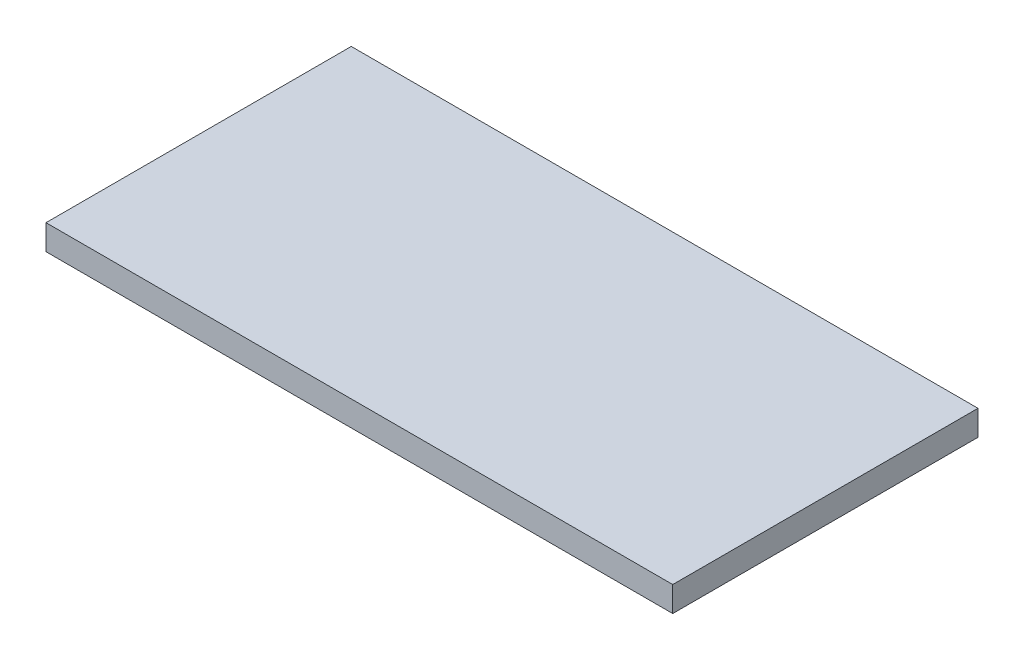
ISO-10303-21;
HEADER;
FILE_DESCRIPTION(('STEP AP214'),'2;1');
FILE_NAME('part.step','',(''),(''),'','','');
FILE_SCHEMA(('AUTOMOTIVE_DESIGN { 1 0 10303 214 1 1 1 1 }'));
ENDSEC;
DATA;
#1=APPLICATION_CONTEXT('core data for automotive mechanical design processes');
#2=APPLICATION_PROTOCOL_DEFINITION('international standard','automotive_design',2000,#1);
#3=PRODUCT_CONTEXT('',#1,'mechanical');
#4=PRODUCT('Part','Part','',(#3));
#5=PRODUCT_RELATED_PRODUCT_CATEGORY('part','',(#4));
#6=PRODUCT_DEFINITION_FORMATION('','',#4);
#7=PRODUCT_DEFINITION_CONTEXT('part definition',#1,'design');
#8=PRODUCT_DEFINITION('design','',#6,#7);
#9=PRODUCT_DEFINITION_SHAPE('','',#8);
#10=(LENGTH_UNIT() NAMED_UNIT(*) SI_UNIT(.MILLI.,.METRE.));
#11=(NAMED_UNIT(*) PLANE_ANGLE_UNIT() SI_UNIT($,.RADIAN.));
#12=(NAMED_UNIT(*) SI_UNIT($,.STERADIAN.) SOLID_ANGLE_UNIT());
#13=UNCERTAINTY_MEASURE_WITH_UNIT(LENGTH_MEASURE(1.E-05),#10,'distance_accuracy_value','');
#14=(GEOMETRIC_REPRESENTATION_CONTEXT(3) GLOBAL_UNCERTAINTY_ASSIGNED_CONTEXT((#13)) GLOBAL_UNIT_ASSIGNED_CONTEXT((#10,
#11,#12)) REPRESENTATION_CONTEXT('',''));
#15=CARTESIAN_POINT('',(0.,0.,0.));
#16=DIRECTION('',(0.,0.,1.));
#17=DIRECTION('',(1.,0.,0.));
#18=AXIS2_PLACEMENT_3D('',#15,#16,#17);
#19=CARTESIAN_POINT('',(124.610213394006,10.,60.6916278383158));
#20=DIRECTION('',(-1.,0.,0.));
#21=DIRECTION('',(0.,0.,1.));
#22=AXIS2_PLACEMENT_3D('',#19,#20,#21);
#23=PLANE('',#22);
#24=DIRECTION('',(0.,0.,-1.));
#25=VECTOR('',#24,1.);
#26=CARTESIAN_POINT('',(124.610213394006,0.,60.6916278383158));
#27=LINE('',#26,#25);
#28=CARTESIAN_POINT('',(124.610213394006,0.,60.6916278383158));
#29=VERTEX_POINT('',#28);
#30=CARTESIAN_POINT('',(124.610213394006,0.,-60.6916278383158));
#31=VERTEX_POINT('',#30);
#32=EDGE_CURVE('E98',#29,#31,#27,.T.);
#33=ORIENTED_EDGE('',*,*,#32,.T.);
#34=DIRECTION('',(0.,-1.,0.));
#35=VECTOR('',#34,1.);
#36=CARTESIAN_POINT('',(124.610213394006,10.,-60.6916278383158));
#37=LINE('',#36,#35);
#38=CARTESIAN_POINT('',(124.610213394006,10.,-60.6916278383158));
#39=VERTEX_POINT('',#38);
#40=EDGE_CURVE('E11',#39,#31,#37,.T.);
#41=ORIENTED_EDGE('',*,*,#40,.F.);
#42=DIRECTION('',(0.,0.,-1.));
#43=VECTOR('',#42,1.);
#44=CARTESIAN_POINT('',(124.610213394006,10.,60.6916278383158));
#45=LINE('',#44,#43);
#46=CARTESIAN_POINT('',(124.610213394006,10.,60.6916278383158));
#47=VERTEX_POINT('',#46);
#48=EDGE_CURVE('E86',#47,#39,#45,.T.);
#49=ORIENTED_EDGE('',*,*,#48,.F.);
#50=DIRECTION('',(0.,-1.,0.));
#51=VECTOR('',#50,1.);
#52=CARTESIAN_POINT('',(124.610213394006,10.,60.6916278383158));
#53=LINE('',#52,#51);
#54=EDGE_CURVE('E94',#47,#29,#53,.T.);
#55=ORIENTED_EDGE('',*,*,#54,.T.);
#56=EDGE_LOOP('',(#33,#41,#49,#55));
#57=FACE_BOUND('',#56,.T.);
#58=ADVANCED_FACE('F35',(#57),#23,.F.);
#59=CARTESIAN_POINT('',(-124.610213394006,10.,-60.6916278383158));
#60=DIRECTION('',(0.,0.,1.));
#61=DIRECTION('',(1.,0.,0.));
#62=AXIS2_PLACEMENT_3D('',#59,#60,#61);
#63=PLANE('',#62);
#64=DIRECTION('',(-1.,0.,0.));
#65=VECTOR('',#64,1.);
#66=CARTESIAN_POINT('',(-124.610213394006,0.,-60.6916278383158));
#67=LINE('',#66,#65);
#68=CARTESIAN_POINT('',(-124.610213394006,0.,-60.6916278383158));
#69=VERTEX_POINT('',#68);
#70=EDGE_CURVE('E90',#31,#69,#67,.T.);
#71=ORIENTED_EDGE('',*,*,#70,.T.);
#72=DIRECTION('',(0.,-1.,0.));
#73=VECTOR('',#72,1.);
#74=CARTESIAN_POINT('',(-124.610213394006,10.,-60.6916278383158));
#75=LINE('',#74,#73);
#76=CARTESIAN_POINT('',(-124.610213394006,10.,-60.6916278383158));
#77=VERTEX_POINT('',#76);
#78=EDGE_CURVE('E43',#77,#69,#75,.T.);
#79=ORIENTED_EDGE('',*,*,#78,.F.);
#80=DIRECTION('',(-1.,0.,0.));
#81=VECTOR('',#80,1.);
#82=CARTESIAN_POINT('',(-124.610213394006,10.,-60.6916278383158));
#83=LINE('',#82,#81);
#84=EDGE_CURVE('E81',#39,#77,#83,.T.);
#85=ORIENTED_EDGE('',*,*,#84,.F.);
#86=ORIENTED_EDGE('',*,*,#40,.T.);
#87=EDGE_LOOP('',(#71,#79,#85,#86));
#88=FACE_BOUND('',#87,.T.);
#89=ADVANCED_FACE('F89',(#88),#63,.F.);
#90=CARTESIAN_POINT('',(-124.610213394006,10.,60.6916278383158));
#91=DIRECTION('',(1.,0.,0.));
#92=DIRECTION('',(0.,0.,-1.));
#93=AXIS2_PLACEMENT_3D('',#90,#91,#92);
#94=PLANE('',#93);
#95=DIRECTION('',(0.,0.,1.));
#96=VECTOR('',#95,1.);
#97=CARTESIAN_POINT('',(-124.610213394006,0.,60.6916278383158));
#98=LINE('',#97,#96);
#99=CARTESIAN_POINT('',(-124.610213394006,0.,60.6916278383158));
#100=VERTEX_POINT('',#99);
#101=EDGE_CURVE('E68',#69,#100,#98,.T.);
#102=ORIENTED_EDGE('',*,*,#101,.T.);
#103=DIRECTION('',(0.,-1.,0.));
#104=VECTOR('',#103,1.);
#105=CARTESIAN_POINT('',(-124.610213394006,10.,60.6916278383158));
#106=LINE('',#105,#104);
#107=CARTESIAN_POINT('',(-124.610213394006,10.,60.6916278383158));
#108=VERTEX_POINT('',#107);
#109=EDGE_CURVE('E91',#108,#100,#106,.T.);
#110=ORIENTED_EDGE('',*,*,#109,.F.);
#111=DIRECTION('',(0.,0.,1.));
#112=VECTOR('',#111,1.);
#113=CARTESIAN_POINT('',(-124.610213394006,10.,60.6916278383158));
#114=LINE('',#113,#112);
#115=EDGE_CURVE('E84',#77,#108,#114,.T.);
#116=ORIENTED_EDGE('',*,*,#115,.F.);
#117=ORIENTED_EDGE('',*,*,#78,.T.);
#118=EDGE_LOOP('',(#102,#110,#116,#117));
#119=FACE_BOUND('',#118,.T.);
#120=ADVANCED_FACE('F92',(#119),#94,.F.);
#121=CARTESIAN_POINT('',(-124.610213394006,10.,60.6916278383158));
#122=DIRECTION('',(0.,0.,-1.));
#123=DIRECTION('',(-1.,0.,0.));
#124=AXIS2_PLACEMENT_3D('',#121,#122,#123);
#125=PLANE('',#124);
#126=DIRECTION('',(1.,0.,0.));
#127=VECTOR('',#126,1.);
#128=CARTESIAN_POINT('',(-124.610213394006,0.,60.6916278383158));
#129=LINE('',#128,#127);
#130=EDGE_CURVE('E74',#100,#29,#129,.T.);
#131=ORIENTED_EDGE('',*,*,#130,.T.);
#132=ORIENTED_EDGE('',*,*,#54,.F.);
#133=DIRECTION('',(1.,0.,0.));
#134=VECTOR('',#133,1.);
#135=CARTESIAN_POINT('',(-124.610213394006,10.,60.6916278383158));
#136=LINE('',#135,#134);
#137=EDGE_CURVE('E51',#108,#47,#136,.T.);
#138=ORIENTED_EDGE('',*,*,#137,.F.);
#139=ORIENTED_EDGE('',*,*,#109,.T.);
#140=EDGE_LOOP('',(#131,#132,#138,#139));
#141=FACE_BOUND('',#140,.T.);
#142=ADVANCED_FACE('F105',(#141),#125,.F.);
#143=CARTESIAN_POINT('',(0.,10.,0.));
#144=DIRECTION('',(0.,-1.,0.));
#145=DIRECTION('',(0.,0.,-1.));
#146=AXIS2_PLACEMENT_3D('',#143,#144,#145);
#147=PLANE('',#146);
#148=ORIENTED_EDGE('',*,*,#48,.T.);
#149=ORIENTED_EDGE('',*,*,#84,.T.);
#150=ORIENTED_EDGE('',*,*,#115,.T.);
#151=ORIENTED_EDGE('',*,*,#137,.T.);
#152=EDGE_LOOP('',(#148,#149,#150,#151));
#153=FACE_BOUND('',#152,.T.);
#154=ADVANCED_FACE('F82',(#153),#147,.F.);
#155=CARTESIAN_POINT('',(0.,0.,0.));
#156=DIRECTION('',(0.,-1.,0.));
#157=DIRECTION('',(0.,0.,-1.));
#158=AXIS2_PLACEMENT_3D('',#155,#156,#157);
#159=PLANE('',#158);
#160=ORIENTED_EDGE('',*,*,#32,.F.);
#161=ORIENTED_EDGE('',*,*,#130,.F.);
#162=ORIENTED_EDGE('',*,*,#101,.F.);
#163=ORIENTED_EDGE('',*,*,#70,.F.);
#164=EDGE_LOOP('',(#160,#161,#162,#163));
#165=FACE_BOUND('',#164,.T.);
#166=ADVANCED_FACE('F108',(#165),#159,.T.);
#167=CLOSED_SHELL('',(#58,#89,#120,#142,#154,#166));
#168=MANIFOLD_SOLID_BREP('B2',#167);
#169=ADVANCED_BREP_SHAPE_REPRESENTATION('',(#18,#168),#14);
#170=SHAPE_DEFINITION_REPRESENTATION(#9,#169);
ENDSEC;
END-ISO-10303-21;
